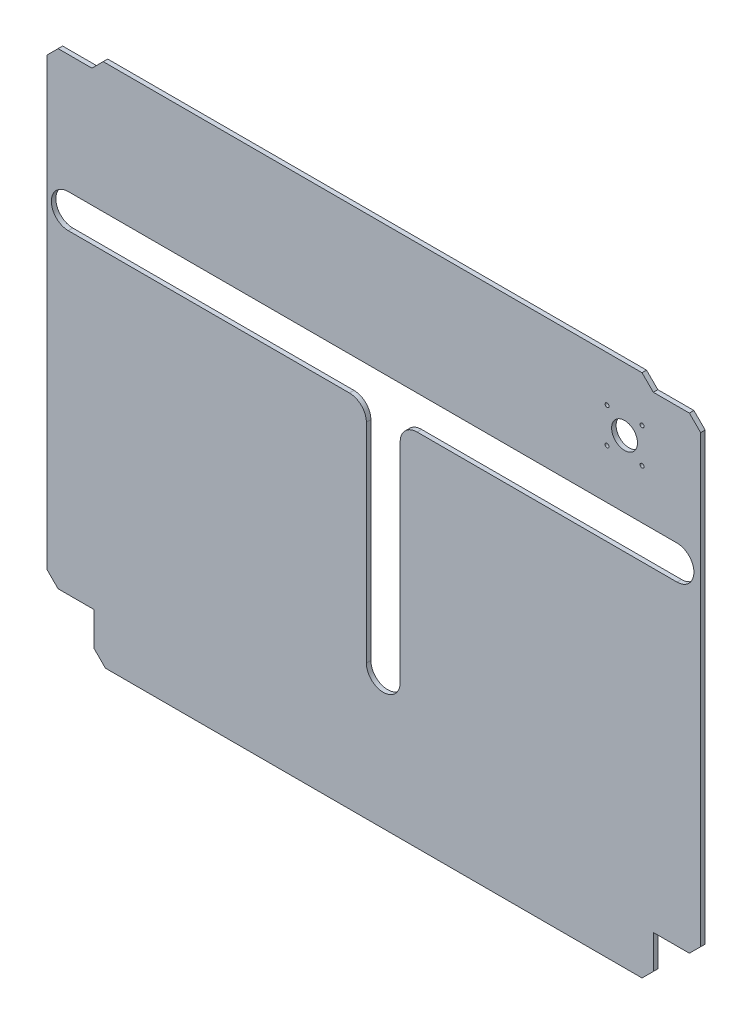
ISO-10303-21;
HEADER;
FILE_DESCRIPTION(('STEP AP214'),'2;1');
FILE_NAME('part.step','',(''),(''),'','','');
FILE_SCHEMA(('AUTOMOTIVE_DESIGN { 1 0 10303 214 1 1 1 1 }'));
ENDSEC;
DATA;
#1=APPLICATION_CONTEXT('core data for automotive mechanical design processes');
#2=APPLICATION_PROTOCOL_DEFINITION('international standard','automotive_design',2000,#1);
#3=PRODUCT_CONTEXT('',#1,'mechanical');
#4=PRODUCT('Part','Part','',(#3));
#5=PRODUCT_RELATED_PRODUCT_CATEGORY('part','',(#4));
#6=PRODUCT_DEFINITION_FORMATION('','',#4);
#7=PRODUCT_DEFINITION_CONTEXT('part definition',#1,'design');
#8=PRODUCT_DEFINITION('design','',#6,#7);
#9=PRODUCT_DEFINITION_SHAPE('','',#8);
#10=(LENGTH_UNIT() NAMED_UNIT(*) SI_UNIT(.MILLI.,.METRE.));
#11=(NAMED_UNIT(*) PLANE_ANGLE_UNIT() SI_UNIT($,.RADIAN.));
#12=(NAMED_UNIT(*) SI_UNIT($,.STERADIAN.) SOLID_ANGLE_UNIT());
#13=UNCERTAINTY_MEASURE_WITH_UNIT(LENGTH_MEASURE(1.E-05),#10,'distance_accuracy_value','');
#14=(GEOMETRIC_REPRESENTATION_CONTEXT(3) GLOBAL_UNCERTAINTY_ASSIGNED_CONTEXT((#13)) GLOBAL_UNIT_ASSIGNED_CONTEXT((#10,
#11,#12)) REPRESENTATION_CONTEXT('',''));
#15=CARTESIAN_POINT('',(0.,0.,0.));
#16=DIRECTION('',(0.,0.,1.));
#17=DIRECTION('',(1.,0.,0.));
#18=AXIS2_PLACEMENT_3D('',#15,#16,#17);
#19=CARTESIAN_POINT('',(519.319741736947,-140.333406017433,-6.));
#20=DIRECTION('',(0.,-1.,0.));
#21=DIRECTION('',(1.,0.,0.));
#22=AXIS2_PLACEMENT_3D('',#19,#20,#21);
#23=PLANE('',#22);
#24=DIRECTION('',(1.,0.,0.));
#25=VECTOR('',#24,1.);
#26=CARTESIAN_POINT('',(519.319741736947,-140.333406017433,4.));
#27=LINE('',#26,#25);
#28=CARTESIAN_POINT('',(-20.6802582630526,-140.333406017433,4.));
#29=VERTEX_POINT('',#28);
#30=CARTESIAN_POINT('',(228.763542148664,-140.333406017433,4.));
#31=VERTEX_POINT('',#30);
#32=EDGE_CURVE('E253',#29,#31,#27,.T.);
#33=ORIENTED_EDGE('',*,*,#32,.T.);
#34=DIRECTION('',(0.,0.,-1.));
#35=VECTOR('',#34,1.);
#36=CARTESIAN_POINT('',(228.763542148664,-140.333406017433,-6.));
#37=LINE('',#36,#35);
#38=CARTESIAN_POINT('',(228.763542148664,-140.333406017433,0.));
#39=VERTEX_POINT('',#38);
#40=EDGE_CURVE('E448',#31,#39,#37,.T.);
#41=ORIENTED_EDGE('',*,*,#40,.T.);
#42=DIRECTION('',(1.,0.,0.));
#43=VECTOR('',#42,1.);
#44=CARTESIAN_POINT('',(0.,-140.333406017433,0.));
#45=LINE('',#44,#43);
#46=CARTESIAN_POINT('',(-20.6802582630526,-140.333406017433,0.));
#47=VERTEX_POINT('',#46);
#48=EDGE_CURVE('E437',#47,#39,#45,.T.);
#49=ORIENTED_EDGE('',*,*,#48,.F.);
#50=DIRECTION('',(0.,0.,1.));
#51=VECTOR('',#50,1.);
#52=CARTESIAN_POINT('',(-20.6802582630526,-140.333406017433,-6.));
#53=LINE('',#52,#51);
#54=EDGE_CURVE('E262',#47,#29,#53,.T.);
#55=ORIENTED_EDGE('',*,*,#54,.T.);
#56=EDGE_LOOP('',(#33,#41,#49,#55));
#57=FACE_BOUND('',#56,.T.);
#58=ADVANCED_FACE('F33',(#57),#23,.F.);
#59=CARTESIAN_POINT('',(0.,0.,4.));
#60=DIRECTION('',(0.,0.,1.));
#61=DIRECTION('',(1.,0.,0.));
#62=AXIS2_PLACEMENT_3D('',#59,#60,#61);
#63=PLANE('',#62);
#64=DIRECTION('',(0.,-1.,0.));
#65=VECTOR('',#64,1.);
#66=CARTESIAN_POINT('',(243.763542148664,1.35315948528816E-13,4.));
#67=LINE('',#66,#65);
#68=CARTESIAN_POINT('',(243.763542148664,-155.333406017433,4.));
#69=VERTEX_POINT('',#68);
#70=CARTESIAN_POINT('',(243.763542148664,-340.333406017433,4.));
#71=VERTEX_POINT('',#70);
#72=EDGE_CURVE('E247',#69,#71,#67,.T.);
#73=ORIENTED_EDGE('',*,*,#72,.F.);
#74=CARTESIAN_POINT('',(228.763542148664,-155.333406017433,4.));
#75=DIRECTION('',(0.,0.,1.));
#76=DIRECTION('',(1.,0.,0.));
#77=AXIS2_PLACEMENT_3D('',#74,#75,#76);
#78=CIRCLE('',#77,15.);
#79=EDGE_CURVE('E458',#69,#31,#78,.T.);
#80=ORIENTED_EDGE('',*,*,#79,.T.);
#81=ORIENTED_EDGE('',*,*,#32,.F.);
#82=CARTESIAN_POINT('',(-20.6802582630526,-125.333406017433,4.));
#83=DIRECTION('',(0.,0.,1.));
#84=DIRECTION('',(1.,0.,0.));
#85=AXIS2_PLACEMENT_3D('',#82,#83,#84);
#86=CIRCLE('',#85,15.);
#87=CARTESIAN_POINT('',(-20.6802582630526,-110.333406017433,4.));
#88=VERTEX_POINT('',#87);
#89=EDGE_CURVE('E250',#88,#29,#86,.T.);
#90=ORIENTED_EDGE('',*,*,#89,.F.);
#91=DIRECTION('',(-1.,0.,0.));
#92=VECTOR('',#91,1.);
#93=CARTESIAN_POINT('',(-20.6802582630526,-110.333406017433,4.));
#94=LINE('',#93,#92);
#95=CARTESIAN_POINT('',(519.319741736947,-110.333406017433,4.));
#96=VERTEX_POINT('',#95);
#97=EDGE_CURVE('E259',#96,#88,#94,.T.);
#98=ORIENTED_EDGE('',*,*,#97,.F.);
#99=CARTESIAN_POINT('',(519.319741736947,-125.333406017433,4.));
#100=DIRECTION('',(0.,0.,1.));
#101=DIRECTION('',(1.,0.,0.));
#102=AXIS2_PLACEMENT_3D('',#99,#100,#101);
#103=CIRCLE('',#102,15.);
#104=CARTESIAN_POINT('',(519.319741736947,-140.333406017433,4.));
#105=VERTEX_POINT('',#104);
#106=EDGE_CURVE('E256',#105,#96,#103,.T.);
#107=ORIENTED_EDGE('',*,*,#106,.F.);
#108=CARTESIAN_POINT('',(288.763542148664,-140.333406017433,4.));
#109=VERTEX_POINT('',#108);
#110=EDGE_CURVE('E252',#109,#105,#27,.T.);
#111=ORIENTED_EDGE('',*,*,#110,.F.);
#112=CARTESIAN_POINT('',(288.763542148664,-155.333406017433,4.));
#113=DIRECTION('',(0.,0.,1.));
#114=DIRECTION('',(1.,0.,0.));
#115=AXIS2_PLACEMENT_3D('',#112,#113,#114);
#116=CIRCLE('',#115,15.);
#117=CARTESIAN_POINT('',(273.763542148664,-155.333406017433,4.));
#118=VERTEX_POINT('',#117);
#119=EDGE_CURVE('E48',#109,#118,#116,.T.);
#120=ORIENTED_EDGE('',*,*,#119,.T.);
#121=DIRECTION('',(0.,1.,0.));
#122=VECTOR('',#121,1.);
#123=CARTESIAN_POINT('',(273.763542148664,0.,4.));
#124=LINE('',#123,#122);
#125=CARTESIAN_POINT('',(273.763542148664,-340.333406017433,4.));
#126=VERTEX_POINT('',#125);
#127=EDGE_CURVE('E244',#126,#118,#124,.T.);
#128=ORIENTED_EDGE('',*,*,#127,.F.);
#129=CARTESIAN_POINT('',(258.763542148664,-340.333406017433,4.));
#130=DIRECTION('',(0.,0.,1.));
#131=DIRECTION('',(1.,0.,0.));
#132=AXIS2_PLACEMENT_3D('',#129,#130,#131);
#133=CIRCLE('',#132,15.);
#134=EDGE_CURVE('E233',#71,#126,#133,.T.);
#135=ORIENTED_EDGE('',*,*,#134,.F.);
#136=EDGE_LOOP('',(#73,#80,#81,#90,#98,#107,#111,#120,#128,#135));
#137=FACE_BOUND('',#136,.T.);
#138=CARTESIAN_POINT('',(488.319741736947,-35.448212977613,4.));
#139=DIRECTION('',(0.,0.,1.));
#140=DIRECTION('',(1.,0.,0.));
#141=AXIS2_PLACEMENT_3D('',#138,#139,#140);
#142=CIRCLE('',#141,1.74999999999998);
#143=CARTESIAN_POINT('',(490.069741736947,-35.448212977613,4.));
#144=VERTEX_POINT('',#143);
#145=EDGE_CURVE('E279',#144,#144,#142,.T.);
#146=ORIENTED_EDGE('',*,*,#145,.F.);
#147=EDGE_LOOP('',(#146));
#148=FACE_BOUND('',#147,.T.);
#149=CARTESIAN_POINT('',(457.319741736947,-66.448212977613,4.));
#150=DIRECTION('',(0.,0.,1.));
#151=DIRECTION('',(1.,0.,0.));
#152=AXIS2_PLACEMENT_3D('',#149,#150,#151);
#153=CIRCLE('',#152,1.74999999999998);
#154=CARTESIAN_POINT('',(459.069741736947,-66.448212977613,4.));
#155=VERTEX_POINT('',#154);
#156=EDGE_CURVE('E291',#155,#155,#153,.T.);
#157=ORIENTED_EDGE('',*,*,#156,.F.);
#158=EDGE_LOOP('',(#157));
#159=FACE_BOUND('',#158,.T.);
#160=DIRECTION('',(0.,1.,0.));
#161=VECTOR('',#160,1.);
#162=CARTESIAN_POINT('',(540.319741736947,-5.00481924912616,4.));
#163=LINE('',#162,#161);
#164=CARTESIAN_POINT('',(540.319741736947,-410.004819249126,4.));
#165=VERTEX_POINT('',#164);
#166=CARTESIAN_POINT('',(540.319741736947,-15.0048192491261,4.));
#167=VERTEX_POINT('',#166);
#168=EDGE_CURVE('E323',#165,#167,#163,.T.);
#169=ORIENTED_EDGE('',*,*,#168,.T.);
#170=DIRECTION('',(0.707106781186551,-0.707106781186544,0.));
#171=VECTOR('',#170,1.);
#172=CARTESIAN_POINT('',(262.657461243908,262.657461243911,4.));
#173=LINE('',#172,#171);
#174=CARTESIAN_POINT('',(530.319741736947,-5.00481924912616,4.));
#175=VERTEX_POINT('',#174);
#176=EDGE_CURVE('E412',#167,#175,#173,.F.);
#177=ORIENTED_EDGE('',*,*,#176,.T.);
#178=DIRECTION('',(-1.,0.,0.));
#179=VECTOR('',#178,1.);
#180=CARTESIAN_POINT('',(498.319741736947,-5.00481924912616,4.));
#181=LINE('',#180,#179);
#182=CARTESIAN_POINT('',(498.319741736947,-5.00481924912616,4.));
#183=VERTEX_POINT('',#182);
#184=EDGE_CURVE('E326',#175,#183,#181,.T.);
#185=ORIENTED_EDGE('',*,*,#184,.T.);
#186=DIRECTION('',(0.707106781186548,-0.707106781186548,0.));
#187=VECTOR('',#186,1.);
#188=CARTESIAN_POINT('',(246.657461243911,246.657461243911,4.));
#189=LINE('',#188,#187);
#190=CARTESIAN_POINT('',(488.319741736947,4.99518075087384,4.));
#191=VERTEX_POINT('',#190);
#192=EDGE_CURVE('E380',#183,#191,#189,.F.);
#193=ORIENTED_EDGE('',*,*,#192,.T.);
#194=DIRECTION('',(-1.,0.,0.));
#195=VECTOR('',#194,1.);
#196=CARTESIAN_POINT('',(0.319741736947331,4.99518075087384,4.));
#197=LINE('',#196,#195);
#198=CARTESIAN_POINT('',(10.3197417369473,4.99518075087384,4.));
#199=VERTEX_POINT('',#198);
#200=EDGE_CURVE('E328',#191,#199,#197,.T.);
#201=ORIENTED_EDGE('',*,*,#200,.T.);
#202=DIRECTION('',(0.707106781186548,0.707106781186548,0.));
#203=VECTOR('',#202,1.);
#204=CARTESIAN_POINT('',(2.66228049303675,-2.66228049303675,4.));
#205=LINE('',#204,#203);
#206=CARTESIAN_POINT('',(0.319741736947333,-5.00481924912616,4.));
#207=VERTEX_POINT('',#206);
#208=EDGE_CURVE('E378',#199,#207,#205,.F.);
#209=ORIENTED_EDGE('',*,*,#208,.T.);
#210=DIRECTION('',(-1.,0.,0.));
#211=VECTOR('',#210,1.);
#212=CARTESIAN_POINT('',(-39.6802582630527,-5.00481924912616,4.));
#213=LINE('',#212,#211);
#214=CARTESIAN_POINT('',(-29.6802582630527,-5.00481924912616,4.));
#215=VERTEX_POINT('',#214);
#216=EDGE_CURVE('E303',#207,#215,#213,.T.);
#217=ORIENTED_EDGE('',*,*,#216,.T.);
#218=DIRECTION('',(0.707106781186548,0.707106781186548,0.));
#219=VECTOR('',#218,1.);
#220=CARTESIAN_POINT('',(-12.3377195069632,12.3377195069632,4.));
#221=LINE('',#220,#219);
#222=CARTESIAN_POINT('',(-39.6802582630527,-15.0048192491262,4.));
#223=VERTEX_POINT('',#222);
#224=EDGE_CURVE('E410',#215,#223,#221,.F.);
#225=ORIENTED_EDGE('',*,*,#224,.T.);
#226=DIRECTION('',(0.,-1.,0.));
#227=VECTOR('',#226,1.);
#228=CARTESIAN_POINT('',(-39.6802582630527,-420.004819249126,4.));
#229=LINE('',#228,#227);
#230=CARTESIAN_POINT('',(-39.6802582630527,-410.004819249126,4.));
#231=VERTEX_POINT('',#230);
#232=EDGE_CURVE('E306',#223,#231,#229,.T.);
#233=ORIENTED_EDGE('',*,*,#232,.T.);
#234=DIRECTION('',(-0.707106781186548,0.707106781186547,0.));
#235=VECTOR('',#234,1.);
#236=CARTESIAN_POINT('',(-224.842538756089,-224.84253875609,4.));
#237=LINE('',#236,#235);
#238=CARTESIAN_POINT('',(-29.6802582630526,-420.004819249126,4.));
#239=VERTEX_POINT('',#238);
#240=EDGE_CURVE('E408',#231,#239,#237,.F.);
#241=ORIENTED_EDGE('',*,*,#240,.T.);
#242=DIRECTION('',(1.,0.,0.));
#243=VECTOR('',#242,1.);
#244=CARTESIAN_POINT('',(2.31974173694734,-420.004819249126,4.));
#245=LINE('',#244,#243);
#246=CARTESIAN_POINT('',(2.31974173694734,-420.004819249126,4.));
#247=VERTEX_POINT('',#246);
#248=EDGE_CURVE('E310',#239,#247,#245,.T.);
#249=ORIENTED_EDGE('',*,*,#248,.T.);
#250=DIRECTION('',(0.,-1.,0.));
#251=VECTOR('',#250,1.);
#252=CARTESIAN_POINT('',(2.31974173694734,-460.004819249126,4.));
#253=LINE('',#252,#251);
#254=CARTESIAN_POINT('',(2.31974173694734,-450.004819249126,4.));
#255=VERTEX_POINT('',#254);
#256=EDGE_CURVE('E312',#247,#255,#253,.T.);
#257=ORIENTED_EDGE('',*,*,#256,.T.);
#258=DIRECTION('',(-0.707106781186548,0.707106781186548,0.));
#259=VECTOR('',#258,1.);
#260=CARTESIAN_POINT('',(-223.842538756089,-223.842538756089,4.));
#261=LINE('',#260,#259);
#262=CARTESIAN_POINT('',(12.3197417369473,-460.004819249126,4.));
#263=VERTEX_POINT('',#262);
#264=EDGE_CURVE('E406',#255,#263,#261,.F.);
#265=ORIENTED_EDGE('',*,*,#264,.T.);
#266=DIRECTION('',(1.,0.,0.));
#267=VECTOR('',#266,1.);
#268=CARTESIAN_POINT('',(2.31974173694734,-460.004819249126,4.));
#269=LINE('',#268,#267);
#270=CARTESIAN_POINT('',(488.319741736947,-460.004819249126,4.));
#271=VERTEX_POINT('',#270);
#272=EDGE_CURVE('E315',#263,#271,#269,.T.);
#273=ORIENTED_EDGE('',*,*,#272,.T.);
#274=DIRECTION('',(-0.707106781186551,-0.707106781186544,0.));
#275=VECTOR('',#274,1.);
#276=CARTESIAN_POINT('',(474.162280493034,-474.162280493039,4.));
#277=LINE('',#276,#275);
#278=CARTESIAN_POINT('',(498.319741736947,-450.004819249126,4.));
#279=VERTEX_POINT('',#278);
#280=EDGE_CURVE('E404',#271,#279,#277,.F.);
#281=ORIENTED_EDGE('',*,*,#280,.T.);
#282=DIRECTION('',(0.,1.,0.));
#283=VECTOR('',#282,1.);
#284=CARTESIAN_POINT('',(498.319741736947,-420.004819249126,4.));
#285=LINE('',#284,#283);
#286=CARTESIAN_POINT('',(498.319741736947,-420.004819249126,4.));
#287=VERTEX_POINT('',#286);
#288=EDGE_CURVE('E318',#279,#287,#285,.T.);
#289=ORIENTED_EDGE('',*,*,#288,.T.);
#290=DIRECTION('',(1.,0.,0.));
#291=VECTOR('',#290,1.);
#292=CARTESIAN_POINT('',(540.319741736947,-420.004819249126,4.));
#293=LINE('',#292,#291);
#294=CARTESIAN_POINT('',(530.319741736947,-420.004819249126,4.));
#295=VERTEX_POINT('',#294);
#296=EDGE_CURVE('E320',#287,#295,#293,.T.);
#297=ORIENTED_EDGE('',*,*,#296,.T.);
#298=DIRECTION('',(-0.707106781186551,-0.707106781186544,0.));
#299=VECTOR('',#298,1.);
#300=CARTESIAN_POINT('',(475.162280493034,-475.162280493039,4.));
#301=LINE('',#300,#299);
#302=EDGE_CURVE('E402',#295,#165,#301,.F.);
#303=ORIENTED_EDGE('',*,*,#302,.T.);
#304=EDGE_LOOP('',(#169,#177,#185,#193,#201,#209,#217,#225,#233,#241,#249,#257,#265,#273,#281,
#289,#297,#303));
#305=FACE_BOUND('',#304,.T.);
#306=CARTESIAN_POINT('',(457.319741736947,-35.448212977613,4.));
#307=DIRECTION('',(0.,0.,1.));
#308=DIRECTION('',(1.,0.,0.));
#309=AXIS2_PLACEMENT_3D('',#306,#307,#308);
#310=CIRCLE('',#309,1.74999999999998);
#311=CARTESIAN_POINT('',(459.069741736947,-35.448212977613,4.));
#312=VERTEX_POINT('',#311);
#313=EDGE_CURVE('E297',#312,#312,#310,.T.);
#314=ORIENTED_EDGE('',*,*,#313,.F.);
#315=EDGE_LOOP('',(#314));
#316=FACE_BOUND('',#315,.T.);
#317=CARTESIAN_POINT('',(488.319741736947,-66.448212977613,4.));
#318=DIRECTION('',(0.,0.,1.));
#319=DIRECTION('',(1.,0.,0.));
#320=AXIS2_PLACEMENT_3D('',#317,#318,#319);
#321=CIRCLE('',#320,1.74999999999998);
#322=CARTESIAN_POINT('',(490.069741736947,-66.448212977613,4.));
#323=VERTEX_POINT('',#322);
#324=EDGE_CURVE('E285',#323,#323,#321,.T.);
#325=ORIENTED_EDGE('',*,*,#324,.F.);
#326=EDGE_LOOP('',(#325));
#327=FACE_BOUND('',#326,.T.);
#328=CARTESIAN_POINT('',(472.819741736947,-50.948212977613,4.));
#329=DIRECTION('',(0.,0.,1.));
#330=DIRECTION('',(1.,0.,0.));
#331=AXIS2_PLACEMENT_3D('',#328,#329,#330);
#332=CIRCLE('',#331,11.5);
#333=CARTESIAN_POINT('',(484.319741736947,-50.948212977613,4.));
#334=VERTEX_POINT('',#333);
#335=EDGE_CURVE('E273',#334,#334,#332,.T.);
#336=ORIENTED_EDGE('',*,*,#335,.F.);
#337=EDGE_LOOP('',(#336));
#338=FACE_BOUND('',#337,.T.);
#339=ADVANCED_FACE('F465',(#137,#148,#159,#305,#316,#327,#338),#63,.T.);
#340=CARTESIAN_POINT('',(0.,0.,0.));
#341=DIRECTION('',(0.,0.,1.));
#342=DIRECTION('',(1.,0.,0.));
#343=AXIS2_PLACEMENT_3D('',#340,#341,#342);
#344=PLANE('',#343);
#345=ORIENTED_EDGE('',*,*,#48,.T.);
#346=CARTESIAN_POINT('',(228.763542148664,-155.333406017433,0.));
#347=DIRECTION('',(0.,0.,1.));
#348=DIRECTION('',(1.,0.,0.));
#349=AXIS2_PLACEMENT_3D('',#346,#347,#348);
#350=CIRCLE('',#349,15.);
#351=CARTESIAN_POINT('',(243.763542148664,-155.333406017433,0.));
#352=VERTEX_POINT('',#351);
#353=EDGE_CURVE('E453',#39,#352,#350,.F.);
#354=ORIENTED_EDGE('',*,*,#353,.T.);
#355=DIRECTION('',(0.,1.,0.));
#356=VECTOR('',#355,1.);
#357=CARTESIAN_POINT('',(243.763542148664,-340.333406017433,0.));
#358=LINE('',#357,#356);
#359=CARTESIAN_POINT('',(243.763542148664,-340.333406017433,0.));
#360=VERTEX_POINT('',#359);
#361=EDGE_CURVE('E235',#360,#352,#358,.T.);
#362=ORIENTED_EDGE('',*,*,#361,.F.);
#363=CARTESIAN_POINT('',(258.763542148664,-340.333406017433,0.));
#364=DIRECTION('',(0.,0.,-1.));
#365=DIRECTION('',(-1.,0.,0.));
#366=AXIS2_PLACEMENT_3D('',#363,#364,#365);
#367=CIRCLE('',#366,15.);
#368=CARTESIAN_POINT('',(273.763542148664,-340.333406017433,0.));
#369=VERTEX_POINT('',#368);
#370=EDGE_CURVE('E225',#369,#360,#367,.T.);
#371=ORIENTED_EDGE('',*,*,#370,.F.);
#372=DIRECTION('',(0.,-1.,0.));
#373=VECTOR('',#372,1.);
#374=CARTESIAN_POINT('',(273.763542148664,-140.333406017433,0.));
#375=LINE('',#374,#373);
#376=CARTESIAN_POINT('',(273.763542148664,-155.333406017433,0.));
#377=VERTEX_POINT('',#376);
#378=EDGE_CURVE('E218',#377,#369,#375,.T.);
#379=ORIENTED_EDGE('',*,*,#378,.F.);
#380=CARTESIAN_POINT('',(288.763542148664,-155.333406017433,0.));
#381=DIRECTION('',(0.,0.,1.));
#382=DIRECTION('',(1.,0.,0.));
#383=AXIS2_PLACEMENT_3D('',#380,#381,#382);
#384=CIRCLE('',#383,15.);
#385=CARTESIAN_POINT('',(288.763542148664,-140.333406017433,0.));
#386=VERTEX_POINT('',#385);
#387=EDGE_CURVE('E451',#377,#386,#384,.F.);
#388=ORIENTED_EDGE('',*,*,#387,.T.);
#389=CARTESIAN_POINT('',(519.319741736947,-140.333406017433,0.));
#390=VERTEX_POINT('',#389);
#391=EDGE_CURVE('E436',#386,#390,#45,.T.);
#392=ORIENTED_EDGE('',*,*,#391,.T.);
#393=CARTESIAN_POINT('',(519.319741736947,-125.333406017433,0.));
#394=DIRECTION('',(0.,0.,1.));
#395=DIRECTION('',(1.,0.,0.));
#396=AXIS2_PLACEMENT_3D('',#393,#394,#395);
#397=CIRCLE('',#396,15.);
#398=CARTESIAN_POINT('',(519.319741736947,-110.333406017433,0.));
#399=VERTEX_POINT('',#398);
#400=EDGE_CURVE('E439',#390,#399,#397,.T.);
#401=ORIENTED_EDGE('',*,*,#400,.T.);
#402=DIRECTION('',(-1.,0.,0.));
#403=VECTOR('',#402,1.);
#404=CARTESIAN_POINT('',(0.,-110.333406017433,0.));
#405=LINE('',#404,#403);
#406=CARTESIAN_POINT('',(-20.6802582630526,-110.333406017433,0.));
#407=VERTEX_POINT('',#406);
#408=EDGE_CURVE('E442',#399,#407,#405,.T.);
#409=ORIENTED_EDGE('',*,*,#408,.T.);
#410=CARTESIAN_POINT('',(-20.6802582630526,-125.333406017433,0.));
#411=DIRECTION('',(0.,0.,1.));
#412=DIRECTION('',(1.,0.,0.));
#413=AXIS2_PLACEMENT_3D('',#410,#411,#412);
#414=CIRCLE('',#413,15.);
#415=EDGE_CURVE('E445',#407,#47,#414,.T.);
#416=ORIENTED_EDGE('',*,*,#415,.T.);
#417=EDGE_LOOP('',(#345,#354,#362,#371,#379,#388,#392,#401,#409,#416));
#418=FACE_BOUND('',#417,.T.);
#419=DIRECTION('',(-1.,0.,0.));
#420=VECTOR('',#419,1.);
#421=CARTESIAN_POINT('',(498.319741736947,-5.00481924912616,0.));
#422=LINE('',#421,#420);
#423=CARTESIAN_POINT('',(530.319741736947,-5.00481924912616,0.));
#424=VERTEX_POINT('',#423);
#425=CARTESIAN_POINT('',(498.319741736947,-5.00481924912616,0.));
#426=VERTEX_POINT('',#425);
#427=EDGE_CURVE('E353',#424,#426,#422,.T.);
#428=ORIENTED_EDGE('',*,*,#427,.F.);
#429=DIRECTION('',(-0.707106781186551,0.707106781186544,0.));
#430=VECTOR('',#429,1.);
#431=CARTESIAN_POINT('',(530.319741736947,-5.00481924912616,0.));
#432=LINE('',#431,#430);
#433=CARTESIAN_POINT('',(540.319741736947,-15.0048192491261,0.));
#434=VERTEX_POINT('',#433);
#435=EDGE_CURVE('E395',#424,#434,#432,.F.);
#436=ORIENTED_EDGE('',*,*,#435,.T.);
#437=DIRECTION('',(0.,1.,0.));
#438=VECTOR('',#437,1.);
#439=CARTESIAN_POINT('',(540.319741736947,-5.00481924912616,0.));
#440=LINE('',#439,#438);
#441=CARTESIAN_POINT('',(540.319741736947,-410.004819249126,0.));
#442=VERTEX_POINT('',#441);
#443=EDGE_CURVE('E350',#442,#434,#440,.T.);
#444=ORIENTED_EDGE('',*,*,#443,.F.);
#445=DIRECTION('',(0.707106781186551,0.707106781186544,0.));
#446=VECTOR('',#445,1.);
#447=CARTESIAN_POINT('',(540.319741736947,-410.004819249126,0.));
#448=LINE('',#447,#446);
#449=CARTESIAN_POINT('',(530.319741736947,-420.004819249126,0.));
#450=VERTEX_POINT('',#449);
#451=EDGE_CURVE('E385',#442,#450,#448,.F.);
#452=ORIENTED_EDGE('',*,*,#451,.T.);
#453=DIRECTION('',(1.,0.,0.));
#454=VECTOR('',#453,1.);
#455=CARTESIAN_POINT('',(540.319741736947,-420.004819249126,0.));
#456=LINE('',#455,#454);
#457=CARTESIAN_POINT('',(498.319741736947,-420.004819249126,0.));
#458=VERTEX_POINT('',#457);
#459=EDGE_CURVE('E347',#458,#450,#456,.T.);
#460=ORIENTED_EDGE('',*,*,#459,.F.);
#461=DIRECTION('',(0.,1.,0.));
#462=VECTOR('',#461,1.);
#463=CARTESIAN_POINT('',(498.319741736947,-420.004819249126,0.));
#464=LINE('',#463,#462);
#465=CARTESIAN_POINT('',(498.319741736947,-450.004819249126,0.));
#466=VERTEX_POINT('',#465);
#467=EDGE_CURVE('E345',#466,#458,#464,.T.);
#468=ORIENTED_EDGE('',*,*,#467,.F.);
#469=DIRECTION('',(0.707106781186551,0.707106781186544,0.));
#470=VECTOR('',#469,1.);
#471=CARTESIAN_POINT('',(498.319741736947,-450.004819249126,0.));
#472=LINE('',#471,#470);
#473=CARTESIAN_POINT('',(488.319741736947,-460.004819249126,0.));
#474=VERTEX_POINT('',#473);
#475=EDGE_CURVE('E387',#466,#474,#472,.F.);
#476=ORIENTED_EDGE('',*,*,#475,.T.);
#477=DIRECTION('',(1.,0.,0.));
#478=VECTOR('',#477,1.);
#479=CARTESIAN_POINT('',(2.31974173694734,-460.004819249126,0.));
#480=LINE('',#479,#478);
#481=CARTESIAN_POINT('',(12.3197417369473,-460.004819249126,0.));
#482=VERTEX_POINT('',#481);
#483=EDGE_CURVE('E342',#482,#474,#480,.T.);
#484=ORIENTED_EDGE('',*,*,#483,.F.);
#485=DIRECTION('',(0.707106781186548,-0.707106781186548,0.));
#486=VECTOR('',#485,1.);
#487=CARTESIAN_POINT('',(12.3197417369473,-460.004819249126,0.));
#488=LINE('',#487,#486);
#489=CARTESIAN_POINT('',(2.31974173694734,-450.004819249126,0.));
#490=VERTEX_POINT('',#489);
#491=EDGE_CURVE('E389',#482,#490,#488,.F.);
#492=ORIENTED_EDGE('',*,*,#491,.T.);
#493=DIRECTION('',(0.,-1.,0.));
#494=VECTOR('',#493,1.);
#495=CARTESIAN_POINT('',(2.31974173694734,-460.004819249126,0.));
#496=LINE('',#495,#494);
#497=CARTESIAN_POINT('',(2.31974173694734,-420.004819249126,0.));
#498=VERTEX_POINT('',#497);
#499=EDGE_CURVE('E339',#498,#490,#496,.T.);
#500=ORIENTED_EDGE('',*,*,#499,.F.);
#501=DIRECTION('',(1.,0.,0.));
#502=VECTOR('',#501,1.);
#503=CARTESIAN_POINT('',(2.31974173694734,-420.004819249126,0.));
#504=LINE('',#503,#502);
#505=CARTESIAN_POINT('',(-29.6802582630526,-420.004819249126,0.));
#506=VERTEX_POINT('',#505);
#507=EDGE_CURVE('E337',#506,#498,#504,.T.);
#508=ORIENTED_EDGE('',*,*,#507,.F.);
#509=DIRECTION('',(0.707106781186548,-0.707106781186547,0.));
#510=VECTOR('',#509,1.);
#511=CARTESIAN_POINT('',(-29.6802582630527,-420.004819249126,0.));
#512=LINE('',#511,#510);
#513=CARTESIAN_POINT('',(-39.6802582630527,-410.004819249126,0.));
#514=VERTEX_POINT('',#513);
#515=EDGE_CURVE('E391',#506,#514,#512,.F.);
#516=ORIENTED_EDGE('',*,*,#515,.T.);
#517=DIRECTION('',(0.,-1.,0.));
#518=VECTOR('',#517,1.);
#519=CARTESIAN_POINT('',(-39.6802582630527,-420.004819249126,0.));
#520=LINE('',#519,#518);
#521=CARTESIAN_POINT('',(-39.6802582630527,-15.0048192491262,0.));
#522=VERTEX_POINT('',#521);
#523=EDGE_CURVE('E334',#522,#514,#520,.T.);
#524=ORIENTED_EDGE('',*,*,#523,.F.);
#525=DIRECTION('',(-0.707106781186548,-0.707106781186548,0.));
#526=VECTOR('',#525,1.);
#527=CARTESIAN_POINT('',(-39.6802582630527,-15.0048192491262,0.));
#528=LINE('',#527,#526);
#529=CARTESIAN_POINT('',(-29.6802582630527,-5.00481924912616,0.));
#530=VERTEX_POINT('',#529);
#531=EDGE_CURVE('E393',#522,#530,#528,.F.);
#532=ORIENTED_EDGE('',*,*,#531,.T.);
#533=DIRECTION('',(-1.,0.,0.));
#534=VECTOR('',#533,1.);
#535=CARTESIAN_POINT('',(-39.6802582630527,-5.00481924912616,0.));
#536=LINE('',#535,#534);
#537=CARTESIAN_POINT('',(0.319741736947333,-5.00481924912616,0.));
#538=VERTEX_POINT('',#537);
#539=EDGE_CURVE('E300',#538,#530,#536,.T.);
#540=ORIENTED_EDGE('',*,*,#539,.F.);
#541=DIRECTION('',(-0.707106781186548,-0.707106781186548,0.));
#542=VECTOR('',#541,1.);
#543=CARTESIAN_POINT('',(0.319741736947333,-5.00481924912617,0.));
#544=LINE('',#543,#542);
#545=CARTESIAN_POINT('',(10.3197417369473,4.99518075087384,0.));
#546=VERTEX_POINT('',#545);
#547=EDGE_CURVE('E373',#538,#546,#544,.F.);
#548=ORIENTED_EDGE('',*,*,#547,.T.);
#549=DIRECTION('',(-1.,0.,0.));
#550=VECTOR('',#549,1.);
#551=CARTESIAN_POINT('',(0.319741736947331,4.99518075087384,0.));
#552=LINE('',#551,#550);
#553=CARTESIAN_POINT('',(488.319741736947,4.99518075087384,0.));
#554=VERTEX_POINT('',#553);
#555=EDGE_CURVE('E307',#554,#546,#552,.T.);
#556=ORIENTED_EDGE('',*,*,#555,.F.);
#557=DIRECTION('',(-0.707106781186548,0.707106781186548,0.));
#558=VECTOR('',#557,1.);
#559=CARTESIAN_POINT('',(488.319741736947,4.99518075087384,0.));
#560=LINE('',#559,#558);
#561=EDGE_CURVE('E375',#554,#426,#560,.F.);
#562=ORIENTED_EDGE('',*,*,#561,.T.);
#563=EDGE_LOOP('',(#428,#436,#444,#452,#460,#468,#476,#484,#492,#500,#508,#516,#524,#532,#540,
#548,#556,#562));
#564=FACE_BOUND('',#563,.T.);
#565=CARTESIAN_POINT('',(457.319741736947,-35.448212977613,0.));
#566=DIRECTION('',(0.,0.,1.));
#567=DIRECTION('',(1.,0.,0.));
#568=AXIS2_PLACEMENT_3D('',#565,#566,#567);
#569=CIRCLE('',#568,1.74999999999998);
#570=CARTESIAN_POINT('',(459.069741736947,-35.448212977613,0.));
#571=VERTEX_POINT('',#570);
#572=EDGE_CURVE('E294',#571,#571,#569,.T.);
#573=ORIENTED_EDGE('',*,*,#572,.T.);
#574=EDGE_LOOP('',(#573));
#575=FACE_BOUND('',#574,.T.);
#576=CARTESIAN_POINT('',(457.319741736947,-66.448212977613,0.));
#577=DIRECTION('',(0.,0.,1.));
#578=DIRECTION('',(1.,0.,0.));
#579=AXIS2_PLACEMENT_3D('',#576,#577,#578);
#580=CIRCLE('',#579,1.74999999999998);
#581=CARTESIAN_POINT('',(459.069741736947,-66.448212977613,0.));
#582=VERTEX_POINT('',#581);
#583=EDGE_CURVE('E288',#582,#582,#580,.T.);
#584=ORIENTED_EDGE('',*,*,#583,.T.);
#585=EDGE_LOOP('',(#584));
#586=FACE_BOUND('',#585,.T.);
#587=CARTESIAN_POINT('',(488.319741736947,-66.448212977613,0.));
#588=DIRECTION('',(0.,0.,1.));
#589=DIRECTION('',(1.,0.,0.));
#590=AXIS2_PLACEMENT_3D('',#587,#588,#589);
#591=CIRCLE('',#590,1.74999999999998);
#592=CARTESIAN_POINT('',(490.069741736947,-66.448212977613,0.));
#593=VERTEX_POINT('',#592);
#594=EDGE_CURVE('E282',#593,#593,#591,.T.);
#595=ORIENTED_EDGE('',*,*,#594,.T.);
#596=EDGE_LOOP('',(#595));
#597=FACE_BOUND('',#596,.T.);
#598=CARTESIAN_POINT('',(488.319741736947,-35.448212977613,0.));
#599=DIRECTION('',(0.,0.,1.));
#600=DIRECTION('',(1.,0.,0.));
#601=AXIS2_PLACEMENT_3D('',#598,#599,#600);
#602=CIRCLE('',#601,1.74999999999998);
#603=CARTESIAN_POINT('',(490.069741736947,-35.448212977613,0.));
#604=VERTEX_POINT('',#603);
#605=EDGE_CURVE('E276',#604,#604,#602,.T.);
#606=ORIENTED_EDGE('',*,*,#605,.T.);
#607=EDGE_LOOP('',(#606));
#608=FACE_BOUND('',#607,.T.);
#609=CARTESIAN_POINT('',(472.819741736947,-50.948212977613,0.));
#610=DIRECTION('',(0.,0.,1.));
#611=DIRECTION('',(1.,0.,0.));
#612=AXIS2_PLACEMENT_3D('',#609,#610,#611);
#613=CIRCLE('',#612,11.5);
#614=CARTESIAN_POINT('',(484.319741736947,-50.948212977613,0.));
#615=VERTEX_POINT('',#614);
#616=EDGE_CURVE('E265',#615,#615,#613,.T.);
#617=ORIENTED_EDGE('',*,*,#616,.T.);
#618=EDGE_LOOP('',(#617));
#619=FACE_BOUND('',#618,.T.);
#620=ADVANCED_FACE('F238',(#418,#564,#575,#586,#597,#608,#619),#344,.F.);
#621=CARTESIAN_POINT('',(-39.6802582630527,-5.00481924912616,4.));
#622=DIRECTION('',(0.,-1.,0.));
#623=DIRECTION('',(1.,0.,0.));
#624=AXIS2_PLACEMENT_3D('',#621,#622,#623);
#625=PLANE('',#624);
#626=ORIENTED_EDGE('',*,*,#539,.T.);
#627=DIRECTION('',(0.,0.,1.));
#628=VECTOR('',#627,1.);
#629=CARTESIAN_POINT('',(-29.6802582630527,-5.00481924912616,4.));
#630=LINE('',#629,#628);
#631=EDGE_CURVE('E419',#530,#215,#630,.T.);
#632=ORIENTED_EDGE('',*,*,#631,.T.);
#633=ORIENTED_EDGE('',*,*,#216,.F.);
#634=DIRECTION('',(0.,0.,-1.));
#635=VECTOR('',#634,1.);
#636=CARTESIAN_POINT('',(0.319741736947333,-5.00481924912616,4.));
#637=LINE('',#636,#635);
#638=EDGE_CURVE('E365',#207,#538,#637,.T.);
#639=ORIENTED_EDGE('',*,*,#638,.T.);
#640=EDGE_LOOP('',(#626,#632,#633,#639));
#641=FACE_BOUND('',#640,.T.);
#642=ADVANCED_FACE('F758',(#641),#625,.F.);
#643=CARTESIAN_POINT('',(-39.6802582630527,-420.004819249126,4.));
#644=DIRECTION('',(1.,0.,0.));
#645=DIRECTION('',(0.,0.,-1.));
#646=AXIS2_PLACEMENT_3D('',#643,#644,#645);
#647=PLANE('',#646);
#648=ORIENTED_EDGE('',*,*,#232,.F.);
#649=DIRECTION('',(0.,0.,-1.));
#650=VECTOR('',#649,1.);
#651=CARTESIAN_POINT('',(-39.6802582630527,-15.0048192491262,4.));
#652=LINE('',#651,#650);
#653=EDGE_CURVE('E416',#223,#522,#652,.T.);
#654=ORIENTED_EDGE('',*,*,#653,.T.);
#655=ORIENTED_EDGE('',*,*,#523,.T.);
#656=DIRECTION('',(0.,0.,1.));
#657=VECTOR('',#656,1.);
#658=CARTESIAN_POINT('',(-39.6802582630527,-410.004819249126,4.));
#659=LINE('',#658,#657);
#660=EDGE_CURVE('E414',#514,#231,#659,.T.);
#661=ORIENTED_EDGE('',*,*,#660,.T.);
#662=EDGE_LOOP('',(#648,#654,#655,#661));
#663=FACE_BOUND('',#662,.T.);
#664=ADVANCED_FACE('F749',(#663),#647,.F.);
#665=CARTESIAN_POINT('',(2.31974173694734,-420.004819249126,4.));
#666=DIRECTION('',(0.,1.,0.));
#667=DIRECTION('',(0.,0.,1.));
#668=AXIS2_PLACEMENT_3D('',#665,#666,#667);
#669=PLANE('',#668);
#670=ORIENTED_EDGE('',*,*,#248,.F.);
#671=DIRECTION('',(0.,0.,-1.));
#672=VECTOR('',#671,1.);
#673=CARTESIAN_POINT('',(-29.6802582630527,-420.004819249126,4.));
#674=LINE('',#673,#672);
#675=EDGE_CURVE('E421',#239,#506,#674,.T.);
#676=ORIENTED_EDGE('',*,*,#675,.T.);
#677=ORIENTED_EDGE('',*,*,#507,.T.);
#678=DIRECTION('',(0.,0.,-1.));
#679=VECTOR('',#678,1.);
#680=CARTESIAN_POINT('',(2.31974173694734,-420.004819249126,4.));
#681=LINE('',#680,#679);
#682=EDGE_CURVE('E362',#247,#498,#681,.T.);
#683=ORIENTED_EDGE('',*,*,#682,.F.);
#684=EDGE_LOOP('',(#670,#676,#677,#683));
#685=FACE_BOUND('',#684,.T.);
#686=ADVANCED_FACE('F740',(#685),#669,.F.);
#687=CARTESIAN_POINT('',(2.31974173694734,-460.004819249126,4.));
#688=DIRECTION('',(1.,0.,0.));
#689=DIRECTION('',(0.,1.,0.));
#690=AXIS2_PLACEMENT_3D('',#687,#688,#689);
#691=PLANE('',#690);
#692=ORIENTED_EDGE('',*,*,#499,.T.);
#693=DIRECTION('',(0.,0.,1.));
#694=VECTOR('',#693,1.);
#695=CARTESIAN_POINT('',(2.31974173694734,-450.004819249126,4.));
#696=LINE('',#695,#694);
#697=EDGE_CURVE('E429',#490,#255,#696,.T.);
#698=ORIENTED_EDGE('',*,*,#697,.T.);
#699=ORIENTED_EDGE('',*,*,#256,.F.);
#700=ORIENTED_EDGE('',*,*,#682,.T.);
#701=EDGE_LOOP('',(#692,#698,#699,#700));
#702=FACE_BOUND('',#701,.T.);
#703=ADVANCED_FACE('F731',(#702),#691,.F.);
#704=CARTESIAN_POINT('',(2.31974173694734,-460.004819249126,4.));
#705=DIRECTION('',(0.,1.,0.));
#706=DIRECTION('',(0.,0.,1.));
#707=AXIS2_PLACEMENT_3D('',#704,#705,#706);
#708=PLANE('',#707);
#709=ORIENTED_EDGE('',*,*,#272,.F.);
#710=DIRECTION('',(0.,0.,-1.));
#711=VECTOR('',#710,1.);
#712=CARTESIAN_POINT('',(12.3197417369473,-460.004819249126,4.));
#713=LINE('',#712,#711);
#714=EDGE_CURVE('E426',#263,#482,#713,.T.);
#715=ORIENTED_EDGE('',*,*,#714,.T.);
#716=ORIENTED_EDGE('',*,*,#483,.T.);
#717=DIRECTION('',(0.,0.,1.));
#718=VECTOR('',#717,1.);
#719=CARTESIAN_POINT('',(488.319741736947,-460.004819249126,4.));
#720=LINE('',#719,#718);
#721=EDGE_CURVE('E424',#474,#271,#720,.T.);
#722=ORIENTED_EDGE('',*,*,#721,.T.);
#723=EDGE_LOOP('',(#709,#715,#716,#722));
#724=FACE_BOUND('',#723,.T.);
#725=ADVANCED_FACE('F722',(#724),#708,.F.);
#726=CARTESIAN_POINT('',(498.319741736947,-420.004819249126,4.));
#727=DIRECTION('',(-1.,0.,0.));
#728=DIRECTION('',(0.,0.,1.));
#729=AXIS2_PLACEMENT_3D('',#726,#727,#728);
#730=PLANE('',#729);
#731=ORIENTED_EDGE('',*,*,#288,.F.);
#732=DIRECTION('',(0.,0.,-1.));
#733=VECTOR('',#732,1.);
#734=CARTESIAN_POINT('',(498.319741736947,-450.004819249126,4.));
#735=LINE('',#734,#733);
#736=EDGE_CURVE('E431',#279,#466,#735,.T.);
#737=ORIENTED_EDGE('',*,*,#736,.T.);
#738=ORIENTED_EDGE('',*,*,#467,.T.);
#739=DIRECTION('',(0.,0.,-1.));
#740=VECTOR('',#739,1.);
#741=CARTESIAN_POINT('',(498.319741736947,-420.004819249126,4.));
#742=LINE('',#741,#740);
#743=EDGE_CURVE('E359',#287,#458,#742,.T.);
#744=ORIENTED_EDGE('',*,*,#743,.F.);
#745=EDGE_LOOP('',(#731,#737,#738,#744));
#746=FACE_BOUND('',#745,.T.);
#747=ADVANCED_FACE('F713',(#746),#730,.F.);
#748=CARTESIAN_POINT('',(540.319741736947,-420.004819249126,4.));
#749=DIRECTION('',(0.,1.,0.));
#750=DIRECTION('',(0.,0.,1.));
#751=AXIS2_PLACEMENT_3D('',#748,#749,#750);
#752=PLANE('',#751);
#753=ORIENTED_EDGE('',*,*,#459,.T.);
#754=DIRECTION('',(0.,0.,1.));
#755=VECTOR('',#754,1.);
#756=CARTESIAN_POINT('',(530.319741736947,-420.004819249126,4.));
#757=LINE('',#756,#755);
#758=EDGE_CURVE('E434',#450,#295,#757,.T.);
#759=ORIENTED_EDGE('',*,*,#758,.T.);
#760=ORIENTED_EDGE('',*,*,#296,.F.);
#761=ORIENTED_EDGE('',*,*,#743,.T.);
#762=EDGE_LOOP('',(#753,#759,#760,#761));
#763=FACE_BOUND('',#762,.T.);
#764=ADVANCED_FACE('F704',(#763),#752,.F.);
#765=CARTESIAN_POINT('',(540.319741736947,-5.00481924912616,4.));
#766=DIRECTION('',(-1.,0.,0.));
#767=DIRECTION('',(0.,0.,1.));
#768=AXIS2_PLACEMENT_3D('',#765,#766,#767);
#769=PLANE('',#768);
#770=ORIENTED_EDGE('',*,*,#443,.T.);
#771=DIRECTION('',(0.,0.,1.));
#772=VECTOR('',#771,1.);
#773=CARTESIAN_POINT('',(540.319741736947,-15.0048192491261,4.));
#774=LINE('',#773,#772);
#775=EDGE_CURVE('E400',#434,#167,#774,.T.);
#776=ORIENTED_EDGE('',*,*,#775,.T.);
#777=ORIENTED_EDGE('',*,*,#168,.F.);
#778=DIRECTION('',(0.,0.,-1.));
#779=VECTOR('',#778,1.);
#780=CARTESIAN_POINT('',(540.319741736947,-410.004819249126,4.));
#781=LINE('',#780,#779);
#782=EDGE_CURVE('E397',#165,#442,#781,.T.);
#783=ORIENTED_EDGE('',*,*,#782,.T.);
#784=EDGE_LOOP('',(#770,#776,#777,#783));
#785=FACE_BOUND('',#784,.T.);
#786=ADVANCED_FACE('F695',(#785),#769,.F.);
#787=CARTESIAN_POINT('',(498.319741736947,-5.00481924912616,4.));
#788=DIRECTION('',(0.,-1.,0.));
#789=DIRECTION('',(0.,0.,-1.));
#790=AXIS2_PLACEMENT_3D('',#787,#788,#789);
#791=PLANE('',#790);
#792=ORIENTED_EDGE('',*,*,#184,.F.);
#793=DIRECTION('',(0.,0.,-1.));
#794=VECTOR('',#793,1.);
#795=CARTESIAN_POINT('',(530.319741736947,-5.00481924912616,4.));
#796=LINE('',#795,#794);
#797=EDGE_CURVE('E382',#175,#424,#796,.T.);
#798=ORIENTED_EDGE('',*,*,#797,.T.);
#799=ORIENTED_EDGE('',*,*,#427,.T.);
#800=DIRECTION('',(0.,0.,-1.));
#801=VECTOR('',#800,1.);
#802=CARTESIAN_POINT('',(498.319741736947,-5.00481924912616,4.));
#803=LINE('',#802,#801);
#804=EDGE_CURVE('E331',#183,#426,#803,.T.);
#805=ORIENTED_EDGE('',*,*,#804,.F.);
#806=EDGE_LOOP('',(#792,#798,#799,#805));
#807=FACE_BOUND('',#806,.T.);
#808=ADVANCED_FACE('F687',(#807),#791,.F.);
#809=CARTESIAN_POINT('',(0.319741736947331,4.99518075087384,4.));
#810=DIRECTION('',(0.,-1.,0.));
#811=DIRECTION('',(0.,0.,-1.));
#812=AXIS2_PLACEMENT_3D('',#809,#810,#811);
#813=PLANE('',#812);
#814=ORIENTED_EDGE('',*,*,#200,.F.);
#815=DIRECTION('',(0.,0.,-1.));
#816=VECTOR('',#815,1.);
#817=CARTESIAN_POINT('',(488.319741736947,4.99518075087384,4.));
#818=LINE('',#817,#816);
#819=EDGE_CURVE('E370',#191,#554,#818,.T.);
#820=ORIENTED_EDGE('',*,*,#819,.T.);
#821=ORIENTED_EDGE('',*,*,#555,.T.);
#822=DIRECTION('',(0.,0.,1.));
#823=VECTOR('',#822,1.);
#824=CARTESIAN_POINT('',(10.3197417369473,4.99518075087384,4.));
#825=LINE('',#824,#823);
#826=EDGE_CURVE('E368',#546,#199,#825,.T.);
#827=ORIENTED_EDGE('',*,*,#826,.T.);
#828=EDGE_LOOP('',(#814,#820,#821,#827));
#829=FACE_BOUND('',#828,.T.);
#830=ADVANCED_FACE('F679',(#829),#813,.F.);
#831=CARTESIAN_POINT('',(457.319741736947,-35.448212977613,4.));
#832=DIRECTION('',(0.,0.,-1.));
#833=DIRECTION('',(-1.,0.,0.));
#834=AXIS2_PLACEMENT_3D('',#831,#832,#833);
#835=CYLINDRICAL_SURFACE('',#834,1.74999999999998);
#836=ORIENTED_EDGE('',*,*,#313,.T.);
#837=EDGE_LOOP('',(#836));
#838=FACE_BOUND('',#837,.T.);
#839=ORIENTED_EDGE('',*,*,#572,.F.);
#840=EDGE_LOOP('',(#839));
#841=FACE_BOUND('',#840,.T.);
#842=ADVANCED_FACE('F670',(#838,#841),#835,.F.);
#843=CARTESIAN_POINT('',(457.319741736947,-66.448212977613,4.));
#844=DIRECTION('',(0.,0.,-1.));
#845=DIRECTION('',(-1.,0.,0.));
#846=AXIS2_PLACEMENT_3D('',#843,#844,#845);
#847=CYLINDRICAL_SURFACE('',#846,1.74999999999998);
#848=ORIENTED_EDGE('',*,*,#156,.T.);
#849=EDGE_LOOP('',(#848));
#850=FACE_BOUND('',#849,.T.);
#851=ORIENTED_EDGE('',*,*,#583,.F.);
#852=EDGE_LOOP('',(#851));
#853=FACE_BOUND('',#852,.T.);
#854=ADVANCED_FACE('F661',(#850,#853),#847,.F.);
#855=CARTESIAN_POINT('',(488.319741736947,-66.448212977613,4.));
#856=DIRECTION('',(0.,0.,-1.));
#857=DIRECTION('',(-1.,0.,0.));
#858=AXIS2_PLACEMENT_3D('',#855,#856,#857);
#859=CYLINDRICAL_SURFACE('',#858,1.74999999999998);
#860=ORIENTED_EDGE('',*,*,#324,.T.);
#861=EDGE_LOOP('',(#860));
#862=FACE_BOUND('',#861,.T.);
#863=ORIENTED_EDGE('',*,*,#594,.F.);
#864=EDGE_LOOP('',(#863));
#865=FACE_BOUND('',#864,.T.);
#866=ADVANCED_FACE('F652',(#862,#865),#859,.F.);
#867=CARTESIAN_POINT('',(488.319741736947,-35.448212977613,4.));
#868=DIRECTION('',(0.,0.,-1.));
#869=DIRECTION('',(-1.,0.,0.));
#870=AXIS2_PLACEMENT_3D('',#867,#868,#869);
#871=CYLINDRICAL_SURFACE('',#870,1.74999999999998);
#872=ORIENTED_EDGE('',*,*,#145,.T.);
#873=EDGE_LOOP('',(#872));
#874=FACE_BOUND('',#873,.T.);
#875=ORIENTED_EDGE('',*,*,#605,.F.);
#876=EDGE_LOOP('',(#875));
#877=FACE_BOUND('',#876,.T.);
#878=ADVANCED_FACE('F643',(#874,#877),#871,.F.);
#879=CARTESIAN_POINT('',(472.819741736947,-50.948212977613,4.));
#880=DIRECTION('',(0.,0.,-1.));
#881=DIRECTION('',(-1.,0.,0.));
#882=AXIS2_PLACEMENT_3D('',#879,#880,#881);
#883=CYLINDRICAL_SURFACE('',#882,11.5);
#884=ORIENTED_EDGE('',*,*,#335,.T.);
#885=EDGE_LOOP('',(#884));
#886=FACE_BOUND('',#885,.T.);
#887=ORIENTED_EDGE('',*,*,#616,.F.);
#888=EDGE_LOOP('',(#887));
#889=FACE_BOUND('',#888,.T.);
#890=ADVANCED_FACE('F633',(#886,#889),#883,.F.);
#891=CARTESIAN_POINT('',(488.319741736947,4.99518075087384,4.));
#892=DIRECTION('',(-0.707106781186547,-0.707106781186547,0.));
#893=DIRECTION('',(0.,0.,-1.));
#894=AXIS2_PLACEMENT_3D('',#891,#892,#893);
#895=PLANE('',#894);
#896=ORIENTED_EDGE('',*,*,#192,.F.);
#897=ORIENTED_EDGE('',*,*,#804,.T.);
#898=ORIENTED_EDGE('',*,*,#561,.F.);
#899=ORIENTED_EDGE('',*,*,#819,.F.);
#900=EDGE_LOOP('',(#896,#897,#898,#899));
#901=FACE_BOUND('',#900,.T.);
#902=ADVANCED_FACE('F623',(#901),#895,.F.);
#903=CARTESIAN_POINT('',(0.319741736947333,-5.00481924912617,4.));
#904=DIRECTION('',(0.707106781186547,-0.707106781186547,0.));
#905=DIRECTION('',(0.,0.,-1.));
#906=AXIS2_PLACEMENT_3D('',#903,#904,#905);
#907=PLANE('',#906);
#908=ORIENTED_EDGE('',*,*,#208,.F.);
#909=ORIENTED_EDGE('',*,*,#826,.F.);
#910=ORIENTED_EDGE('',*,*,#547,.F.);
#911=ORIENTED_EDGE('',*,*,#638,.F.);
#912=EDGE_LOOP('',(#908,#909,#910,#911));
#913=FACE_BOUND('',#912,.T.);
#914=ADVANCED_FACE('F613',(#913),#907,.F.);
#915=CARTESIAN_POINT('',(530.319741736947,-5.00481924912616,4.));
#916=DIRECTION('',(-0.707106781186544,-0.707106781186551,0.));
#917=DIRECTION('',(0.,0.,-1.));
#918=AXIS2_PLACEMENT_3D('',#915,#916,#917);
#919=PLANE('',#918);
#920=ORIENTED_EDGE('',*,*,#176,.F.);
#921=ORIENTED_EDGE('',*,*,#775,.F.);
#922=ORIENTED_EDGE('',*,*,#435,.F.);
#923=ORIENTED_EDGE('',*,*,#797,.F.);
#924=EDGE_LOOP('',(#920,#921,#922,#923));
#925=FACE_BOUND('',#924,.T.);
#926=ADVANCED_FACE('F604',(#925),#919,.F.);
#927=CARTESIAN_POINT('',(-39.6802582630527,-15.0048192491262,4.));
#928=DIRECTION('',(0.707106781186547,-0.707106781186547,0.));
#929=DIRECTION('',(0.,0.,-1.));
#930=AXIS2_PLACEMENT_3D('',#927,#928,#929);
#931=PLANE('',#930);
#932=ORIENTED_EDGE('',*,*,#224,.F.);
#933=ORIENTED_EDGE('',*,*,#631,.F.);
#934=ORIENTED_EDGE('',*,*,#531,.F.);
#935=ORIENTED_EDGE('',*,*,#653,.F.);
#936=EDGE_LOOP('',(#932,#933,#934,#935));
#937=FACE_BOUND('',#936,.T.);
#938=ADVANCED_FACE('F595',(#937),#931,.F.);
#939=CARTESIAN_POINT('',(-29.6802582630527,-420.004819249126,4.));
#940=DIRECTION('',(0.707106781186547,0.707106781186548,0.));
#941=DIRECTION('',(0.,0.,-1.));
#942=AXIS2_PLACEMENT_3D('',#939,#940,#941);
#943=PLANE('',#942);
#944=ORIENTED_EDGE('',*,*,#240,.F.);
#945=ORIENTED_EDGE('',*,*,#660,.F.);
#946=ORIENTED_EDGE('',*,*,#515,.F.);
#947=ORIENTED_EDGE('',*,*,#675,.F.);
#948=EDGE_LOOP('',(#944,#945,#946,#947));
#949=FACE_BOUND('',#948,.T.);
#950=ADVANCED_FACE('F586',(#949),#943,.F.);
#951=CARTESIAN_POINT('',(12.3197417369473,-460.004819249126,4.));
#952=DIRECTION('',(0.707106781186547,0.707106781186547,0.));
#953=DIRECTION('',(0.,0.,-1.));
#954=AXIS2_PLACEMENT_3D('',#951,#952,#953);
#955=PLANE('',#954);
#956=ORIENTED_EDGE('',*,*,#264,.F.);
#957=ORIENTED_EDGE('',*,*,#697,.F.);
#958=ORIENTED_EDGE('',*,*,#491,.F.);
#959=ORIENTED_EDGE('',*,*,#714,.F.);
#960=EDGE_LOOP('',(#956,#957,#958,#959));
#961=FACE_BOUND('',#960,.T.);
#962=ADVANCED_FACE('F577',(#961),#955,.F.);
#963=CARTESIAN_POINT('',(498.319741736947,-450.004819249126,4.));
#964=DIRECTION('',(-0.707106781186543,0.707106781186551,0.));
#965=DIRECTION('',(0.,0.,-1.));
#966=AXIS2_PLACEMENT_3D('',#963,#964,#965);
#967=PLANE('',#966);
#968=ORIENTED_EDGE('',*,*,#280,.F.);
#969=ORIENTED_EDGE('',*,*,#721,.F.);
#970=ORIENTED_EDGE('',*,*,#475,.F.);
#971=ORIENTED_EDGE('',*,*,#736,.F.);
#972=EDGE_LOOP('',(#968,#969,#970,#971));
#973=FACE_BOUND('',#972,.T.);
#974=ADVANCED_FACE('F568',(#973),#967,.F.);
#975=CARTESIAN_POINT('',(540.319741736947,-410.004819249126,4.));
#976=DIRECTION('',(-0.707106781186543,0.707106781186551,0.));
#977=DIRECTION('',(0.,0.,-1.));
#978=AXIS2_PLACEMENT_3D('',#975,#976,#977);
#979=PLANE('',#978);
#980=ORIENTED_EDGE('',*,*,#302,.F.);
#981=ORIENTED_EDGE('',*,*,#758,.F.);
#982=ORIENTED_EDGE('',*,*,#451,.F.);
#983=ORIENTED_EDGE('',*,*,#782,.F.);
#984=EDGE_LOOP('',(#980,#981,#982,#983));
#985=FACE_BOUND('',#984,.T.);
#986=ADVANCED_FACE('F560',(#985),#979,.F.);
#987=CARTESIAN_POINT('',(-20.6802582630526,-125.333406017433,-6.));
#988=DIRECTION('',(0.,0.,1.));
#989=DIRECTION('',(1.,0.,0.));
#990=AXIS2_PLACEMENT_3D('',#987,#988,#989);
#991=CYLINDRICAL_SURFACE('',#990,15.);
#992=DIRECTION('',(0.,0.,1.));
#993=VECTOR('',#992,1.);
#994=CARTESIAN_POINT('',(-20.6802582630526,-110.333406017433,-6.));
#995=LINE('',#994,#993);
#996=EDGE_CURVE('E263',#407,#88,#995,.T.);
#997=ORIENTED_EDGE('',*,*,#996,.T.);
#998=ORIENTED_EDGE('',*,*,#89,.T.);
#999=ORIENTED_EDGE('',*,*,#54,.F.);
#1000=ORIENTED_EDGE('',*,*,#415,.F.);
#1001=EDGE_LOOP('',(#997,#998,#999,#1000));
#1002=FACE_BOUND('',#1001,.T.);
#1003=ADVANCED_FACE('F500',(#1002),#991,.F.);
#1004=CARTESIAN_POINT('',(-20.6802582630526,-110.333406017433,-6.));
#1005=DIRECTION('',(0.,1.,0.));
#1006=DIRECTION('',(-1.,0.,0.));
#1007=AXIS2_PLACEMENT_3D('',#1004,#1005,#1006);
#1008=PLANE('',#1007);
#1009=DIRECTION('',(0.,0.,1.));
#1010=VECTOR('',#1009,1.);
#1011=CARTESIAN_POINT('',(519.319741736947,-110.333406017433,-6.));
#1012=LINE('',#1011,#1010);
#1013=EDGE_CURVE('E266',#399,#96,#1012,.T.);
#1014=ORIENTED_EDGE('',*,*,#1013,.T.);
#1015=ORIENTED_EDGE('',*,*,#97,.T.);
#1016=ORIENTED_EDGE('',*,*,#996,.F.);
#1017=ORIENTED_EDGE('',*,*,#408,.F.);
#1018=EDGE_LOOP('',(#1014,#1015,#1016,#1017));
#1019=FACE_BOUND('',#1018,.T.);
#1020=ADVANCED_FACE('F496',(#1019),#1008,.F.);
#1021=CARTESIAN_POINT('',(519.319741736947,-125.333406017433,-6.));
#1022=DIRECTION('',(0.,0.,1.));
#1023=DIRECTION('',(1.,0.,0.));
#1024=AXIS2_PLACEMENT_3D('',#1021,#1022,#1023);
#1025=CYLINDRICAL_SURFACE('',#1024,15.);
#1026=DIRECTION('',(0.,0.,1.));
#1027=VECTOR('',#1026,1.);
#1028=CARTESIAN_POINT('',(519.319741736947,-140.333406017433,-6.));
#1029=LINE('',#1028,#1027);
#1030=EDGE_CURVE('E268',#390,#105,#1029,.T.);
#1031=ORIENTED_EDGE('',*,*,#1030,.T.);
#1032=ORIENTED_EDGE('',*,*,#106,.T.);
#1033=ORIENTED_EDGE('',*,*,#1013,.F.);
#1034=ORIENTED_EDGE('',*,*,#400,.F.);
#1035=EDGE_LOOP('',(#1031,#1032,#1033,#1034));
#1036=FACE_BOUND('',#1035,.T.);
#1037=ADVANCED_FACE('F471',(#1036),#1025,.F.);
#1038=ORIENTED_EDGE('',*,*,#391,.F.);
#1039=DIRECTION('',(0.,0.,1.));
#1040=VECTOR('',#1039,1.);
#1041=CARTESIAN_POINT('',(288.763542148664,-140.333406017433,-6.));
#1042=LINE('',#1041,#1040);
#1043=EDGE_CURVE('E41',#386,#109,#1042,.T.);
#1044=ORIENTED_EDGE('',*,*,#1043,.T.);
#1045=ORIENTED_EDGE('',*,*,#110,.T.);
#1046=ORIENTED_EDGE('',*,*,#1030,.F.);
#1047=EDGE_LOOP('',(#1038,#1044,#1045,#1046));
#1048=FACE_BOUND('',#1047,.T.);
#1049=ADVANCED_FACE('F461',(#1048),#23,.F.);
#1050=CARTESIAN_POINT('',(243.763542148664,-340.333406017433,10.));
#1051=DIRECTION('',(-1.,0.,0.));
#1052=DIRECTION('',(0.,-1.,0.));
#1053=AXIS2_PLACEMENT_3D('',#1050,#1051,#1052);
#1054=PLANE('',#1053);
#1055=ORIENTED_EDGE('',*,*,#361,.T.);
#1056=DIRECTION('',(0.,0.,-1.));
#1057=VECTOR('',#1056,1.);
#1058=CARTESIAN_POINT('',(243.763542148664,-155.333406017433,10.));
#1059=LINE('',#1058,#1057);
#1060=EDGE_CURVE('E455',#352,#69,#1059,.F.);
#1061=ORIENTED_EDGE('',*,*,#1060,.T.);
#1062=ORIENTED_EDGE('',*,*,#72,.T.);
#1063=DIRECTION('',(0.,0.,-1.));
#1064=VECTOR('',#1063,1.);
#1065=CARTESIAN_POINT('',(243.763542148664,-340.333406017433,10.));
#1066=LINE('',#1065,#1064);
#1067=EDGE_CURVE('E234',#71,#360,#1066,.T.);
#1068=ORIENTED_EDGE('',*,*,#1067,.T.);
#1069=EDGE_LOOP('',(#1055,#1061,#1062,#1068));
#1070=FACE_BOUND('',#1069,.T.);
#1071=ADVANCED_FACE('F489',(#1070),#1054,.F.);
#1072=CARTESIAN_POINT('',(258.763542148664,-340.333406017433,10.));
#1073=DIRECTION('',(0.,0.,-1.));
#1074=DIRECTION('',(-1.,0.,0.));
#1075=AXIS2_PLACEMENT_3D('',#1072,#1073,#1074);
#1076=CYLINDRICAL_SURFACE('',#1075,15.);
#1077=ORIENTED_EDGE('',*,*,#134,.T.);
#1078=DIRECTION('',(0.,0.,-1.));
#1079=VECTOR('',#1078,1.);
#1080=CARTESIAN_POINT('',(273.763542148664,-340.333406017433,10.));
#1081=LINE('',#1080,#1079);
#1082=EDGE_CURVE('E221',#126,#369,#1081,.T.);
#1083=ORIENTED_EDGE('',*,*,#1082,.T.);
#1084=ORIENTED_EDGE('',*,*,#370,.T.);
#1085=ORIENTED_EDGE('',*,*,#1067,.F.);
#1086=EDGE_LOOP('',(#1077,#1083,#1084,#1085));
#1087=FACE_BOUND('',#1086,.T.);
#1088=ADVANCED_FACE('F229',(#1087),#1076,.F.);
#1089=CARTESIAN_POINT('',(273.763542148664,-140.333406017433,10.));
#1090=DIRECTION('',(1.,0.,0.));
#1091=DIRECTION('',(0.,0.,-1.));
#1092=AXIS2_PLACEMENT_3D('',#1089,#1090,#1091);
#1093=PLANE('',#1092);
#1094=ORIENTED_EDGE('',*,*,#127,.T.);
#1095=DIRECTION('',(0.,0.,1.));
#1096=VECTOR('',#1095,1.);
#1097=CARTESIAN_POINT('',(273.763542148664,-155.333406017433,10.));
#1098=LINE('',#1097,#1096);
#1099=EDGE_CURVE('E11',#118,#377,#1098,.F.);
#1100=ORIENTED_EDGE('',*,*,#1099,.T.);
#1101=ORIENTED_EDGE('',*,*,#378,.T.);
#1102=ORIENTED_EDGE('',*,*,#1082,.F.);
#1103=EDGE_LOOP('',(#1094,#1100,#1101,#1102));
#1104=FACE_BOUND('',#1103,.T.);
#1105=ADVANCED_FACE('F220',(#1104),#1093,.F.);
#1106=CARTESIAN_POINT('',(228.763542148664,-155.333406017433,-6.));
#1107=DIRECTION('',(0.,0.,-1.));
#1108=DIRECTION('',(-1.,0.,0.));
#1109=AXIS2_PLACEMENT_3D('',#1106,#1107,#1108);
#1110=CYLINDRICAL_SURFACE('',#1109,15.);
#1111=ORIENTED_EDGE('',*,*,#79,.F.);
#1112=ORIENTED_EDGE('',*,*,#1060,.F.);
#1113=ORIENTED_EDGE('',*,*,#353,.F.);
#1114=ORIENTED_EDGE('',*,*,#40,.F.);
#1115=EDGE_LOOP('',(#1111,#1112,#1113,#1114));
#1116=FACE_BOUND('',#1115,.T.);
#1117=ADVANCED_FACE('F474',(#1116),#1110,.T.);
#1118=CARTESIAN_POINT('',(288.763542148664,-155.333406017433,-6.));
#1119=DIRECTION('',(0.,0.,1.));
#1120=DIRECTION('',(1.,0.,0.));
#1121=AXIS2_PLACEMENT_3D('',#1118,#1119,#1120);
#1122=CYLINDRICAL_SURFACE('',#1121,15.);
#1123=ORIENTED_EDGE('',*,*,#387,.F.);
#1124=ORIENTED_EDGE('',*,*,#1099,.F.);
#1125=ORIENTED_EDGE('',*,*,#119,.F.);
#1126=ORIENTED_EDGE('',*,*,#1043,.F.);
#1127=EDGE_LOOP('',(#1123,#1124,#1125,#1126));
#1128=FACE_BOUND('',#1127,.T.);
#1129=ADVANCED_FACE('F35',(#1128),#1122,.T.);
#1130=CLOSED_SHELL('',(#58,#339,#620,#642,#664,#686,#703,#725,#747,#764,#786,#808,#830,#842,
#854,#866,#878,#890,#902,#914,#926,#938,#950,#962,#974,#986,#1003,#1020,#1037,#1049,#1071,#1088,
#1105,#1117,#1129));
#1131=MANIFOLD_SOLID_BREP('B2',#1130);
#1132=ADVANCED_BREP_SHAPE_REPRESENTATION('',(#18,#1131),#14);
#1133=SHAPE_DEFINITION_REPRESENTATION(#9,#1132);
ENDSEC;
END-ISO-10303-21;
